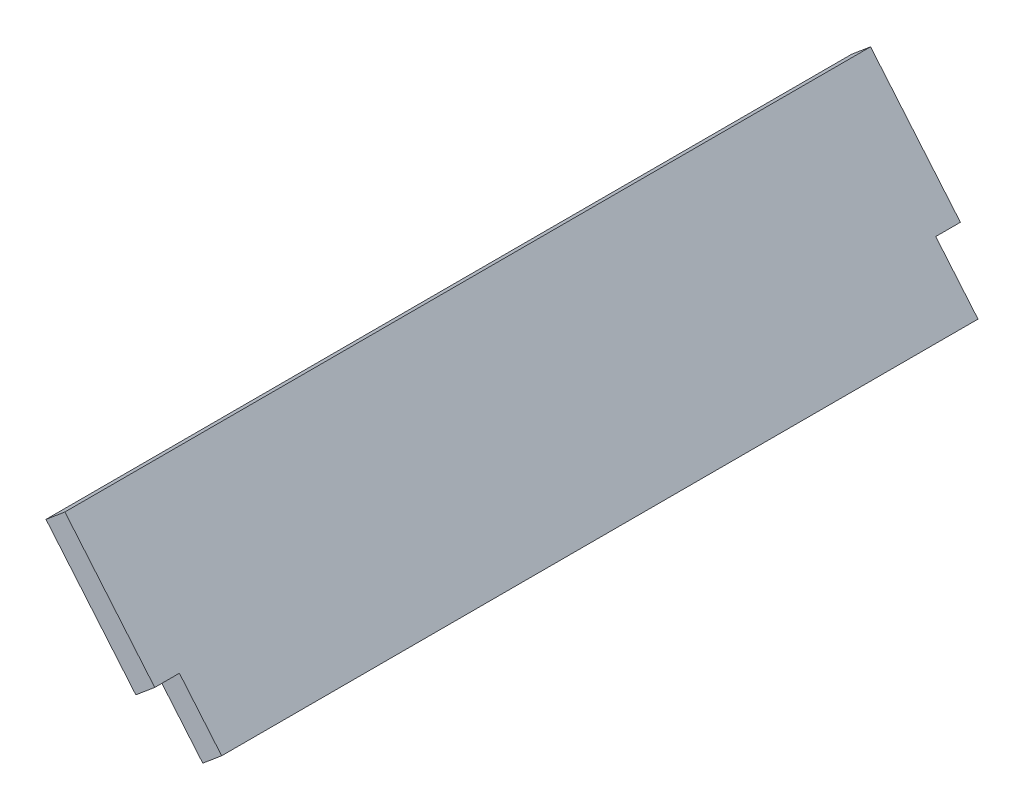
ISO-10303-21;
HEADER;
FILE_DESCRIPTION(('STEP AP214'),'2;1');
FILE_NAME('part.step','',(''),(''),'','','');
FILE_SCHEMA(('AUTOMOTIVE_DESIGN { 1 0 10303 214 1 1 1 1 }'));
ENDSEC;
DATA;
#1=APPLICATION_CONTEXT('core data for automotive mechanical design processes');
#2=APPLICATION_PROTOCOL_DEFINITION('international standard','automotive_design',2000,#1);
#3=PRODUCT_CONTEXT('',#1,'mechanical');
#4=PRODUCT('Part','Part','',(#3));
#5=PRODUCT_RELATED_PRODUCT_CATEGORY('part','',(#4));
#6=PRODUCT_DEFINITION_FORMATION('','',#4);
#7=PRODUCT_DEFINITION_CONTEXT('part definition',#1,'design');
#8=PRODUCT_DEFINITION('design','',#6,#7);
#9=PRODUCT_DEFINITION_SHAPE('','',#8);
#10=(LENGTH_UNIT() NAMED_UNIT(*) SI_UNIT(.MILLI.,.METRE.));
#11=(NAMED_UNIT(*) PLANE_ANGLE_UNIT() SI_UNIT($,.RADIAN.));
#12=(NAMED_UNIT(*) SI_UNIT($,.STERADIAN.) SOLID_ANGLE_UNIT());
#13=UNCERTAINTY_MEASURE_WITH_UNIT(LENGTH_MEASURE(1.E-05),#10,'distance_accuracy_value','');
#14=(GEOMETRIC_REPRESENTATION_CONTEXT(3) GLOBAL_UNCERTAINTY_ASSIGNED_CONTEXT((#13)) GLOBAL_UNIT_ASSIGNED_CONTEXT((#10,
#11,#12)) REPRESENTATION_CONTEXT('',''));
#15=CARTESIAN_POINT('',(0.,0.,0.));
#16=DIRECTION('',(0.,0.,1.));
#17=DIRECTION('',(1.,0.,0.));
#18=AXIS2_PLACEMENT_3D('',#15,#16,#17);
#19=CARTESIAN_POINT('',(0.,0.,0.));
#20=DIRECTION('',(0.,0.,1.));
#21=DIRECTION('',(1.,0.,0.));
#22=AXIS2_PLACEMENT_3D('',#19,#20,#21);
#23=PLANE('',#22);
#24=DIRECTION('',(-0.766044443118982,-0.642787609686535,0.));
#25=VECTOR('',#24,1.);
#26=CARTESIAN_POINT('',(24.1513667721069,-1.92652096774672,0.));
#27=LINE('',#26,#25);
#28=CARTESIAN_POINT('',(10.9273893646711,-13.0227555330227,0.));
#29=VERTEX_POINT('',#28);
#30=CARTESIAN_POINT('',(8.62925603531414,-14.9511183620823,0.));
#31=VERTEX_POINT('',#30);
#32=EDGE_CURVE('E47',#29,#31,#27,.T.);
#33=ORIENTED_EDGE('',*,*,#32,.F.);
#34=DIRECTION('',(-0.642787609686532,0.766044443118984,0.));
#35=VECTOR('',#34,1.);
#36=CARTESIAN_POINT('',(0.,0.,0.));
#37=LINE('',#36,#35);
#38=CARTESIAN_POINT('',(16.0696902421633,-19.1511110779746,0.));
#39=VERTEX_POINT('',#38);
#40=EDGE_CURVE('E145',#39,#29,#37,.T.);
#41=ORIENTED_EDGE('',*,*,#40,.F.);
#42=DIRECTION('',(0.766044443118982,0.642787609686534,0.));
#43=VECTOR('',#42,1.);
#44=CARTESIAN_POINT('',(16.0696902421633,-19.1511110779746,0.));
#45=LINE('',#44,#43);
#46=CARTESIAN_POINT('',(13.7715569128064,-21.0794739070341,0.));
#47=VERTEX_POINT('',#46);
#48=EDGE_CURVE('E151',#47,#39,#45,.T.);
#49=ORIENTED_EDGE('',*,*,#48,.F.);
#50=DIRECTION('',(0.642787609686535,-0.766044443118982,0.));
#51=VECTOR('',#50,1.);
#52=CARTESIAN_POINT('',(-2.29813332935695,-1.92836282905961,0.));
#53=LINE('',#52,#51);
#54=EDGE_CURVE('E141',#31,#47,#53,.T.);
#55=ORIENTED_EDGE('',*,*,#54,.F.);
#56=EDGE_LOOP('',(#33,#41,#49,#55));
#57=FACE_BOUND('',#56,.T.);
#58=ADVANCED_FACE('F32',(#57),#23,.F.);
#59=CARTESIAN_POINT('',(0.,0.,92.));
#60=DIRECTION('',(0.,0.,1.));
#61=DIRECTION('',(1.,0.,0.));
#62=AXIS2_PLACEMENT_3D('',#59,#60,#61);
#63=PLANE('',#62);
#64=DIRECTION('',(-0.642787609686532,0.766044443118984,0.));
#65=VECTOR('',#64,1.);
#66=CARTESIAN_POINT('',(0.,0.,92.));
#67=LINE('',#66,#65);
#68=CARTESIAN_POINT('',(16.0696902421633,-19.1511110779746,92.));
#69=VERTEX_POINT('',#68);
#70=CARTESIAN_POINT('',(10.9273893646711,-13.0227555330227,92.));
#71=VERTEX_POINT('',#70);
#72=EDGE_CURVE('E147',#69,#71,#67,.T.);
#73=ORIENTED_EDGE('',*,*,#72,.T.);
#74=DIRECTION('',(-0.766044443118982,-0.642787609686535,0.));
#75=VECTOR('',#74,1.);
#76=CARTESIAN_POINT('',(24.1513667721069,-1.92652096774672,92.));
#77=LINE('',#76,#75);
#78=CARTESIAN_POINT('',(8.62925603531415,-14.9511183620823,92.));
#79=VERTEX_POINT('',#78);
#80=EDGE_CURVE('E135',#71,#79,#77,.T.);
#81=ORIENTED_EDGE('',*,*,#80,.T.);
#82=DIRECTION('',(0.642787609686535,-0.766044443118982,0.));
#83=VECTOR('',#82,1.);
#84=CARTESIAN_POINT('',(-2.29813332935695,-1.92836282905961,92.));
#85=LINE('',#84,#83);
#86=CARTESIAN_POINT('',(13.7715569128064,-21.0794739070341,92.));
#87=VERTEX_POINT('',#86);
#88=EDGE_CURVE('E142',#79,#87,#85,.T.);
#89=ORIENTED_EDGE('',*,*,#88,.T.);
#90=DIRECTION('',(0.766044443118982,0.642787609686534,0.));
#91=VECTOR('',#90,1.);
#92=CARTESIAN_POINT('',(16.0696902421633,-19.1511110779746,92.));
#93=LINE('',#92,#91);
#94=EDGE_CURVE('E144',#87,#69,#93,.T.);
#95=ORIENTED_EDGE('',*,*,#94,.T.);
#96=EDGE_LOOP('',(#73,#81,#89,#95));
#97=FACE_BOUND('',#96,.T.);
#98=ADVANCED_FACE('F178',(#97),#63,.T.);
#99=CARTESIAN_POINT('',(0.,0.,92.));
#100=DIRECTION('',(0.642787609686535,-0.766044443118982,0.));
#101=DIRECTION('',(0.766044443118982,0.642787609686535,0.));
#102=AXIS2_PLACEMENT_3D('',#99,#100,#101);
#103=PLANE('',#102);
#104=DIRECTION('',(0.,0.,-1.));
#105=VECTOR('',#104,1.);
#106=CARTESIAN_POINT('',(0.,0.,92.));
#107=LINE('',#106,#105);
#108=CARTESIAN_POINT('',(0.,0.,95.));
#109=VERTEX_POINT('',#108);
#110=CARTESIAN_POINT('',(0.,0.,-3.));
#111=VERTEX_POINT('',#110);
#112=EDGE_CURVE('E111',#109,#111,#107,.T.);
#113=ORIENTED_EDGE('',*,*,#112,.T.);
#114=DIRECTION('',(-0.766044443118982,-0.642787609686535,0.));
#115=VECTOR('',#114,1.);
#116=CARTESIAN_POINT('',(13.2239774074359,11.096234565276,-3.));
#117=LINE('',#116,#115);
#118=CARTESIAN_POINT('',(-2.29813332935695,-1.92836282905961,-3.));
#119=VERTEX_POINT('',#118);
#120=EDGE_CURVE('E110',#111,#119,#117,.T.);
#121=ORIENTED_EDGE('',*,*,#120,.T.);
#122=DIRECTION('',(0.,0.,-1.));
#123=VECTOR('',#122,1.);
#124=CARTESIAN_POINT('',(-2.29813332935695,-1.92836282905961,92.));
#125=LINE('',#124,#123);
#126=CARTESIAN_POINT('',(-2.29813332935695,-1.92836282905961,95.));
#127=VERTEX_POINT('',#126);
#128=EDGE_CURVE('E11',#127,#119,#125,.T.);
#129=ORIENTED_EDGE('',*,*,#128,.F.);
#130=DIRECTION('',(-0.766044443118982,-0.642787609686535,0.));
#131=VECTOR('',#130,1.);
#132=CARTESIAN_POINT('',(13.2239774074359,11.096234565276,95.));
#133=LINE('',#132,#131);
#134=EDGE_CURVE('E132',#109,#127,#133,.T.);
#135=ORIENTED_EDGE('',*,*,#134,.F.);
#136=EDGE_LOOP('',(#113,#121,#129,#135));
#137=FACE_BOUND('',#136,.T.);
#138=ADVANCED_FACE('F34',(#137),#103,.F.);
#139=CARTESIAN_POINT('',(-2.29813332935695,-1.92836282905961,92.));
#140=DIRECTION('',(0.766044443118982,0.642787609686535,0.));
#141=DIRECTION('',(-0.642787609686535,0.766044443118982,0.));
#142=AXIS2_PLACEMENT_3D('',#139,#140,#141);
#143=PLANE('',#142);
#144=ORIENTED_EDGE('',*,*,#128,.T.);
#145=DIRECTION('',(0.642787609686535,-0.766044443118982,0.));
#146=VECTOR('',#145,1.);
#147=CARTESIAN_POINT('',(8.62925603531414,-14.9511183620823,-3.));
#148=LINE('',#147,#146);
#149=CARTESIAN_POINT('',(8.62925603531414,-14.9511183620823,-3.));
#150=VERTEX_POINT('',#149);
#151=EDGE_CURVE('E102',#119,#150,#148,.T.);
#152=ORIENTED_EDGE('',*,*,#151,.T.);
#153=DIRECTION('',(0.,0.,1.));
#154=VECTOR('',#153,1.);
#155=CARTESIAN_POINT('',(8.62925603531414,-14.9511183620823,0.));
#156=LINE('',#155,#154);
#157=EDGE_CURVE('E116',#150,#31,#156,.T.);
#158=ORIENTED_EDGE('',*,*,#157,.T.);
#159=ORIENTED_EDGE('',*,*,#54,.T.);
#160=DIRECTION('',(0.,0.,-1.));
#161=VECTOR('',#160,1.);
#162=CARTESIAN_POINT('',(13.7715569128064,-21.0794739070341,92.));
#163=LINE('',#162,#161);
#164=EDGE_CURVE('E40',#87,#47,#163,.T.);
#165=ORIENTED_EDGE('',*,*,#164,.F.);
#166=ORIENTED_EDGE('',*,*,#88,.F.);
#167=DIRECTION('',(0.,0.,1.));
#168=VECTOR('',#167,1.);
#169=CARTESIAN_POINT('',(8.62925603531414,-14.9511183620823,92.));
#170=LINE('',#169,#168);
#171=CARTESIAN_POINT('',(8.62925603531414,-14.9511183620823,95.));
#172=VERTEX_POINT('',#171);
#173=EDGE_CURVE('E55',#79,#172,#170,.T.);
#174=ORIENTED_EDGE('',*,*,#173,.T.);
#175=DIRECTION('',(-0.642787609686535,0.766044443118982,0.));
#176=VECTOR('',#175,1.);
#177=CARTESIAN_POINT('',(8.62925603531414,-14.9511183620823,95.));
#178=LINE('',#177,#176);
#179=EDGE_CURVE('E105',#172,#127,#178,.T.);
#180=ORIENTED_EDGE('',*,*,#179,.T.);
#181=EDGE_LOOP('',(#144,#152,#158,#159,#165,#166,#174,#180));
#182=FACE_BOUND('',#181,.T.);
#183=ADVANCED_FACE('F99',(#182),#143,.F.);
#184=CARTESIAN_POINT('',(16.0696902421633,-19.1511110779746,92.));
#185=DIRECTION('',(-0.642787609686534,0.766044443118982,0.));
#186=DIRECTION('',(-0.766044443118982,-0.642787609686535,0.));
#187=AXIS2_PLACEMENT_3D('',#184,#185,#186);
#188=PLANE('',#187);
#189=ORIENTED_EDGE('',*,*,#48,.T.);
#190=DIRECTION('',(0.,0.,-1.));
#191=VECTOR('',#190,1.);
#192=CARTESIAN_POINT('',(16.0696902421633,-19.1511110779746,92.));
#193=LINE('',#192,#191);
#194=EDGE_CURVE('E155',#69,#39,#193,.T.);
#195=ORIENTED_EDGE('',*,*,#194,.F.);
#196=ORIENTED_EDGE('',*,*,#94,.F.);
#197=ORIENTED_EDGE('',*,*,#164,.T.);
#198=EDGE_LOOP('',(#189,#195,#196,#197));
#199=FACE_BOUND('',#198,.T.);
#200=ADVANCED_FACE('F162',(#199),#188,.F.);
#201=CARTESIAN_POINT('',(0.,0.,92.));
#202=DIRECTION('',(-0.766044443118984,-0.642787609686532,0.));
#203=DIRECTION('',(0.642787609686532,-0.766044443118984,0.));
#204=AXIS2_PLACEMENT_3D('',#201,#202,#203);
#205=PLANE('',#204);
#206=ORIENTED_EDGE('',*,*,#40,.T.);
#207=DIRECTION('',(0.,0.,-1.));
#208=VECTOR('',#207,1.);
#209=CARTESIAN_POINT('',(10.9273893646711,-13.0227555330227,0.));
#210=LINE('',#209,#208);
#211=CARTESIAN_POINT('',(10.9273893646711,-13.0227555330227,-3.));
#212=VERTEX_POINT('',#211);
#213=EDGE_CURVE('E123',#29,#212,#210,.T.);
#214=ORIENTED_EDGE('',*,*,#213,.T.);
#215=DIRECTION('',(-0.642787609686532,0.766044443118984,0.));
#216=VECTOR('',#215,1.);
#217=CARTESIAN_POINT('',(10.927389364671,-13.0227555330227,-3.));
#218=LINE('',#217,#216);
#219=EDGE_CURVE('E127',#212,#111,#218,.T.);
#220=ORIENTED_EDGE('',*,*,#219,.T.);
#221=ORIENTED_EDGE('',*,*,#112,.F.);
#222=DIRECTION('',(0.642787609686532,-0.766044443118984,0.));
#223=VECTOR('',#222,1.);
#224=CARTESIAN_POINT('',(10.927389364671,-13.0227555330227,95.));
#225=LINE('',#224,#223);
#226=CARTESIAN_POINT('',(10.9273893646711,-13.0227555330227,95.));
#227=VERTEX_POINT('',#226);
#228=EDGE_CURVE('E129',#109,#227,#225,.T.);
#229=ORIENTED_EDGE('',*,*,#228,.T.);
#230=DIRECTION('',(0.,0.,-1.));
#231=VECTOR('',#230,1.);
#232=CARTESIAN_POINT('',(10.9273893646711,-13.0227555330227,92.));
#233=LINE('',#232,#231);
#234=EDGE_CURVE('E131',#227,#71,#233,.T.);
#235=ORIENTED_EDGE('',*,*,#234,.T.);
#236=ORIENTED_EDGE('',*,*,#72,.F.);
#237=ORIENTED_EDGE('',*,*,#194,.T.);
#238=EDGE_LOOP('',(#206,#214,#220,#221,#229,#235,#236,#237));
#239=FACE_BOUND('',#238,.T.);
#240=ADVANCED_FACE('F167',(#239),#205,.F.);
#241=CARTESIAN_POINT('',(24.1513667721069,-1.92652096774672,95.));
#242=DIRECTION('',(0.,0.,1.));
#243=DIRECTION('',(1.,0.,0.));
#244=AXIS2_PLACEMENT_3D('',#241,#242,#243);
#245=PLANE('',#244);
#246=ORIENTED_EDGE('',*,*,#228,.F.);
#247=ORIENTED_EDGE('',*,*,#134,.T.);
#248=ORIENTED_EDGE('',*,*,#179,.F.);
#249=DIRECTION('',(-0.766044443118982,-0.642787609686535,0.));
#250=VECTOR('',#249,1.);
#251=CARTESIAN_POINT('',(24.1513667721069,-1.92652096774672,95.));
#252=LINE('',#251,#250);
#253=EDGE_CURVE('E137',#227,#172,#252,.T.);
#254=ORIENTED_EDGE('',*,*,#253,.F.);
#255=EDGE_LOOP('',(#246,#247,#248,#254));
#256=FACE_BOUND('',#255,.T.);
#257=ADVANCED_FACE('F174',(#256),#245,.T.);
#258=CARTESIAN_POINT('',(24.1513667721069,-1.92652096774672,92.));
#259=DIRECTION('',(0.642787609686535,-0.766044443118982,0.));
#260=DIRECTION('',(0.766044443118982,0.642787609686535,0.));
#261=AXIS2_PLACEMENT_3D('',#258,#259,#260);
#262=PLANE('',#261);
#263=ORIENTED_EDGE('',*,*,#234,.F.);
#264=ORIENTED_EDGE('',*,*,#253,.T.);
#265=ORIENTED_EDGE('',*,*,#173,.F.);
#266=ORIENTED_EDGE('',*,*,#80,.F.);
#267=EDGE_LOOP('',(#263,#264,#265,#266));
#268=FACE_BOUND('',#267,.T.);
#269=ADVANCED_FACE('F176',(#268),#262,.T.);
#270=CARTESIAN_POINT('',(24.1513667721069,-1.92652096774672,0.));
#271=DIRECTION('',(0.642787609686535,-0.766044443118982,0.));
#272=DIRECTION('',(0.766044443118982,0.642787609686535,0.));
#273=AXIS2_PLACEMENT_3D('',#270,#271,#272);
#274=PLANE('',#273);
#275=ORIENTED_EDGE('',*,*,#213,.F.);
#276=ORIENTED_EDGE('',*,*,#32,.T.);
#277=ORIENTED_EDGE('',*,*,#157,.F.);
#278=DIRECTION('',(-0.766044443118982,-0.642787609686535,0.));
#279=VECTOR('',#278,1.);
#280=CARTESIAN_POINT('',(24.1513667721069,-1.92652096774672,-3.));
#281=LINE('',#280,#279);
#282=EDGE_CURVE('E115',#212,#150,#281,.T.);
#283=ORIENTED_EDGE('',*,*,#282,.F.);
#284=EDGE_LOOP('',(#275,#276,#277,#283));
#285=FACE_BOUND('',#284,.T.);
#286=ADVANCED_FACE('F170',(#285),#274,.T.);
#287=CARTESIAN_POINT('',(24.1513667721069,-1.92652096774672,-3.));
#288=DIRECTION('',(0.,0.,-1.));
#289=DIRECTION('',(-1.,0.,0.));
#290=AXIS2_PLACEMENT_3D('',#287,#288,#289);
#291=PLANE('',#290);
#292=ORIENTED_EDGE('',*,*,#219,.F.);
#293=ORIENTED_EDGE('',*,*,#282,.T.);
#294=ORIENTED_EDGE('',*,*,#151,.F.);
#295=ORIENTED_EDGE('',*,*,#120,.F.);
#296=EDGE_LOOP('',(#292,#293,#294,#295));
#297=FACE_BOUND('',#296,.T.);
#298=ADVANCED_FACE('F118',(#297),#291,.T.);
#299=CLOSED_SHELL('',(#58,#98,#138,#183,#200,#240,#257,#269,#286,#298));
#300=MANIFOLD_SOLID_BREP('B2',#299);
#301=ADVANCED_BREP_SHAPE_REPRESENTATION('',(#18,#300),#14);
#302=SHAPE_DEFINITION_REPRESENTATION(#9,#301);
ENDSEC;
END-ISO-10303-21;
